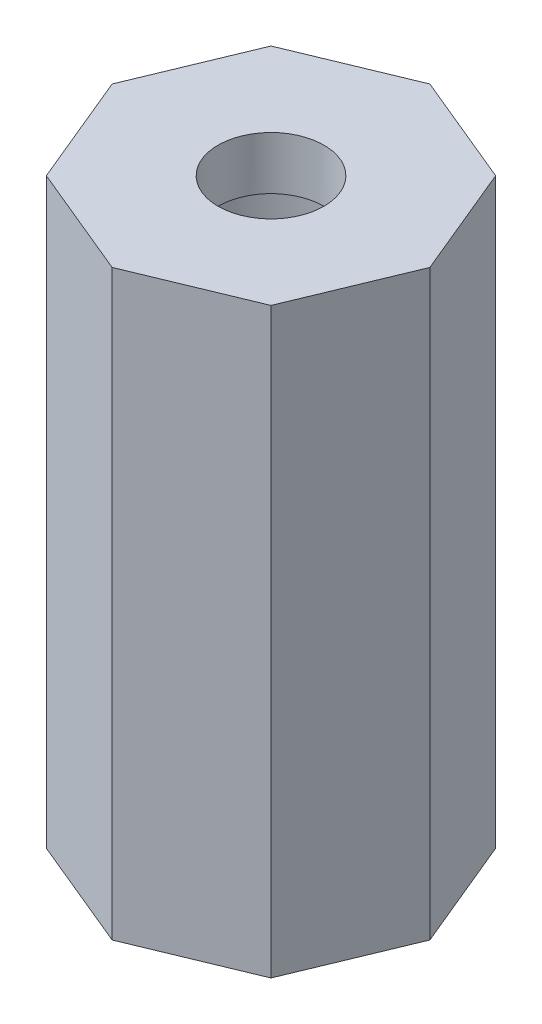
ISO-10303-21;
HEADER;
FILE_DESCRIPTION(('STEP AP214'),'2;1');
FILE_NAME('part.step','',(''),(''),'','','');
FILE_SCHEMA(('AUTOMOTIVE_DESIGN { 1 0 10303 214 1 1 1 1 }'));
ENDSEC;
DATA;
#1=APPLICATION_CONTEXT('core data for automotive mechanical design processes');
#2=APPLICATION_PROTOCOL_DEFINITION('international standard','automotive_design',2000,#1);
#3=PRODUCT_CONTEXT('',#1,'mechanical');
#4=PRODUCT('Part','Part','',(#3));
#5=PRODUCT_RELATED_PRODUCT_CATEGORY('part','',(#4));
#6=PRODUCT_DEFINITION_FORMATION('','',#4);
#7=PRODUCT_DEFINITION_CONTEXT('part definition',#1,'design');
#8=PRODUCT_DEFINITION('design','',#6,#7);
#9=PRODUCT_DEFINITION_SHAPE('','',#8);
#10=(LENGTH_UNIT() NAMED_UNIT(*) SI_UNIT(.MILLI.,.METRE.));
#11=(NAMED_UNIT(*) PLANE_ANGLE_UNIT() SI_UNIT($,.RADIAN.));
#12=(NAMED_UNIT(*) SI_UNIT($,.STERADIAN.) SOLID_ANGLE_UNIT());
#13=UNCERTAINTY_MEASURE_WITH_UNIT(LENGTH_MEASURE(1.E-05),#10,'distance_accuracy_value','');
#14=(GEOMETRIC_REPRESENTATION_CONTEXT(3) GLOBAL_UNCERTAINTY_ASSIGNED_CONTEXT((#13)) GLOBAL_UNIT_ASSIGNED_CONTEXT((#10,
#11,#12)) REPRESENTATION_CONTEXT('',''));
#15=CARTESIAN_POINT('',(0.,0.,0.));
#16=DIRECTION('',(0.,0.,1.));
#17=DIRECTION('',(1.,0.,0.));
#18=AXIS2_PLACEMENT_3D('',#15,#16,#17);
#19=CARTESIAN_POINT('',(0.,0.,0.));
#20=DIRECTION('',(0.,1.,0.));
#21=DIRECTION('',(0.,0.,1.));
#22=AXIS2_PLACEMENT_3D('',#19,#20,#21);
#23=CYLINDRICAL_SURFACE('',#22,10.);
#24=CARTESIAN_POINT('',(0.,110.,0.));
#25=DIRECTION('',(0.,1.,0.));
#26=DIRECTION('',(0.,0.,1.));
#27=AXIS2_PLACEMENT_3D('',#24,#25,#26);
#28=CIRCLE('',#27,10.);
#29=CARTESIAN_POINT('',(0.,110.,10.));
#30=VERTEX_POINT('',#29);
#31=EDGE_CURVE('E135',#30,#30,#28,.T.);
#32=ORIENTED_EDGE('',*,*,#31,.T.);
#33=EDGE_LOOP('',(#32));
#34=FACE_BOUND('',#33,.T.);
#35=CARTESIAN_POINT('',(0.,100.,0.));
#36=DIRECTION('',(0.,-1.,0.));
#37=DIRECTION('',(0.,0.,-1.));
#38=AXIS2_PLACEMENT_3D('',#35,#36,#37);
#39=CIRCLE('',#38,10.);
#40=CARTESIAN_POINT('',(0.,100.,-10.));
#41=VERTEX_POINT('',#40);
#42=EDGE_CURVE('E37',#41,#41,#39,.F.);
#43=ORIENTED_EDGE('',*,*,#42,.F.);
#44=EDGE_LOOP('',(#43));
#45=FACE_BOUND('',#44,.T.);
#46=ADVANCED_FACE('F33',(#34,#45),#23,.F.);
#47=CARTESIAN_POINT('',(21.2132034355967,110.,21.2132034355962));
#48=DIRECTION('',(-0.923879532511292,0.,-0.382683432365078));
#49=DIRECTION('',(-0.382683432365078,0.,0.923879532511292));
#50=AXIS2_PLACEMENT_3D('',#47,#48,#49);
#51=PLANE('',#50);
#52=DIRECTION('',(0.382683432365078,0.,-0.923879532511292));
#53=VECTOR('',#52,1.);
#54=CARTESIAN_POINT('',(21.2132034355967,0.,21.2132034355962));
#55=LINE('',#54,#53);
#56=CARTESIAN_POINT('',(21.2132034355967,0.,21.2132034355962));
#57=VERTEX_POINT('',#56);
#58=CARTESIAN_POINT('',(30.,0.,-3.72098185597026E-13));
#59=VERTEX_POINT('',#58);
#60=EDGE_CURVE('E131',#57,#59,#55,.T.);
#61=ORIENTED_EDGE('',*,*,#60,.T.);
#62=DIRECTION('',(0.,-1.,0.));
#63=VECTOR('',#62,1.);
#64=CARTESIAN_POINT('',(30.,110.,-3.72098185597026E-13));
#65=LINE('',#64,#63);
#66=CARTESIAN_POINT('',(30.,110.,-3.72098185597026E-13));
#67=VERTEX_POINT('',#66);
#68=EDGE_CURVE('E11',#67,#59,#65,.T.);
#69=ORIENTED_EDGE('',*,*,#68,.F.);
#70=DIRECTION('',(0.382683432365078,0.,-0.923879532511292));
#71=VECTOR('',#70,1.);
#72=CARTESIAN_POINT('',(21.2132034355967,110.,21.2132034355962));
#73=LINE('',#72,#71);
#74=CARTESIAN_POINT('',(21.2132034355967,110.,21.2132034355962));
#75=VERTEX_POINT('',#74);
#76=EDGE_CURVE('E146',#75,#67,#73,.T.);
#77=ORIENTED_EDGE('',*,*,#76,.F.);
#78=DIRECTION('',(0.,-1.,0.));
#79=VECTOR('',#78,1.);
#80=CARTESIAN_POINT('',(21.2132034355967,110.,21.2132034355962));
#81=LINE('',#80,#79);
#82=EDGE_CURVE('E127',#75,#57,#81,.T.);
#83=ORIENTED_EDGE('',*,*,#82,.T.);
#84=EDGE_LOOP('',(#61,#69,#77,#83));
#85=FACE_BOUND('',#84,.T.);
#86=ADVANCED_FACE('F35',(#85),#51,.F.);
#87=CARTESIAN_POINT('',(30.,110.,-3.72098185597026E-13));
#88=DIRECTION('',(-0.923879532511282,0.,0.382683432365101));
#89=DIRECTION('',(0.382683432365101,0.,0.923879532511282));
#90=AXIS2_PLACEMENT_3D('',#87,#88,#89);
#91=PLANE('',#90);
#92=DIRECTION('',(-0.382683432365101,0.,-0.923879532511282));
#93=VECTOR('',#92,1.);
#94=CARTESIAN_POINT('',(30.,0.,-3.72098185597026E-13));
#95=LINE('',#94,#93);
#96=CARTESIAN_POINT('',(21.2132034355962,0.,-21.2132034355967));
#97=VERTEX_POINT('',#96);
#98=EDGE_CURVE('E134',#59,#97,#95,.T.);
#99=ORIENTED_EDGE('',*,*,#98,.T.);
#100=DIRECTION('',(0.,-1.,0.));
#101=VECTOR('',#100,1.);
#102=CARTESIAN_POINT('',(21.2132034355962,110.,-21.2132034355967));
#103=LINE('',#102,#101);
#104=CARTESIAN_POINT('',(21.2132034355962,110.,-21.2132034355967));
#105=VERTEX_POINT('',#104);
#106=EDGE_CURVE('E43',#105,#97,#103,.T.);
#107=ORIENTED_EDGE('',*,*,#106,.F.);
#108=DIRECTION('',(-0.382683432365101,0.,-0.923879532511282));
#109=VECTOR('',#108,1.);
#110=CARTESIAN_POINT('',(30.,110.,-3.72098185597026E-13));
#111=LINE('',#110,#109);
#112=EDGE_CURVE('E94',#67,#105,#111,.T.);
#113=ORIENTED_EDGE('',*,*,#112,.F.);
#114=ORIENTED_EDGE('',*,*,#68,.T.);
#115=EDGE_LOOP('',(#99,#107,#113,#114));
#116=FACE_BOUND('',#115,.T.);
#117=ADVANCED_FACE('F200',(#116),#91,.F.);
#118=CARTESIAN_POINT('',(21.2132034355962,110.,-21.2132034355967));
#119=DIRECTION('',(-0.382683432365078,0.,0.923879532511292));
#120=DIRECTION('',(0.923879532511292,0.,0.382683432365078));
#121=AXIS2_PLACEMENT_3D('',#118,#119,#120);
#122=PLANE('',#121);
#123=DIRECTION('',(-0.923879532511292,0.,-0.382683432365078));
#124=VECTOR('',#123,1.);
#125=CARTESIAN_POINT('',(21.2132034355962,0.,-21.2132034355967));
#126=LINE('',#125,#124);
#127=CARTESIAN_POINT('',(-3.74350811283092E-13,0.,-30.));
#128=VERTEX_POINT('',#127);
#129=EDGE_CURVE('E137',#97,#128,#126,.T.);
#130=ORIENTED_EDGE('',*,*,#129,.T.);
#131=DIRECTION('',(0.,-1.,0.));
#132=VECTOR('',#131,1.);
#133=CARTESIAN_POINT('',(-3.74350811283092E-13,110.,-30.));
#134=LINE('',#133,#132);
#135=CARTESIAN_POINT('',(-3.74350811283092E-13,110.,-30.));
#136=VERTEX_POINT('',#135);
#137=EDGE_CURVE('E153',#136,#128,#134,.T.);
#138=ORIENTED_EDGE('',*,*,#137,.F.);
#139=DIRECTION('',(-0.923879532511292,0.,-0.382683432365078));
#140=VECTOR('',#139,1.);
#141=CARTESIAN_POINT('',(21.2132034355962,110.,-21.2132034355967));
#142=LINE('',#141,#140);
#143=EDGE_CURVE('E162',#105,#136,#142,.T.);
#144=ORIENTED_EDGE('',*,*,#143,.F.);
#145=ORIENTED_EDGE('',*,*,#106,.T.);
#146=EDGE_LOOP('',(#130,#138,#144,#145));
#147=FACE_BOUND('',#146,.T.);
#148=ADVANCED_FACE('F160',(#147),#122,.F.);
#149=CARTESIAN_POINT('',(-3.74350811283092E-13,110.,-30.));
#150=DIRECTION('',(0.382683432365101,0.,0.923879532511282));
#151=DIRECTION('',(0.923879532511282,0.,-0.382683432365101));
#152=AXIS2_PLACEMENT_3D('',#149,#150,#151);
#153=PLANE('',#152);
#154=DIRECTION('',(-0.923879532511282,0.,0.382683432365101));
#155=VECTOR('',#154,1.);
#156=CARTESIAN_POINT('',(-3.74350811283092E-13,0.,-30.));
#157=LINE('',#156,#155);
#158=CARTESIAN_POINT('',(-21.2132034355967,0.,-21.2132034355962));
#159=VERTEX_POINT('',#158);
#160=EDGE_CURVE('E139',#128,#159,#157,.T.);
#161=ORIENTED_EDGE('',*,*,#160,.T.);
#162=DIRECTION('',(0.,-1.,0.));
#163=VECTOR('',#162,1.);
#164=CARTESIAN_POINT('',(-21.2132034355967,110.,-21.2132034355962));
#165=LINE('',#164,#163);
#166=CARTESIAN_POINT('',(-21.2132034355967,110.,-21.2132034355962));
#167=VERTEX_POINT('',#166);
#168=EDGE_CURVE('E150',#167,#159,#165,.T.);
#169=ORIENTED_EDGE('',*,*,#168,.F.);
#170=DIRECTION('',(-0.923879532511282,0.,0.382683432365101));
#171=VECTOR('',#170,1.);
#172=CARTESIAN_POINT('',(-3.74350811283092E-13,110.,-30.));
#173=LINE('',#172,#171);
#174=EDGE_CURVE('E174',#136,#167,#173,.T.);
#175=ORIENTED_EDGE('',*,*,#174,.F.);
#176=ORIENTED_EDGE('',*,*,#137,.T.);
#177=EDGE_LOOP('',(#161,#169,#175,#176));
#178=FACE_BOUND('',#177,.T.);
#179=ADVANCED_FACE('F170',(#178),#153,.F.);
#180=CARTESIAN_POINT('',(-21.2132034355967,110.,-21.2132034355962));
#181=DIRECTION('',(0.923879532511292,0.,0.382683432365078));
#182=DIRECTION('',(0.382683432365078,0.,-0.923879532511292));
#183=AXIS2_PLACEMENT_3D('',#180,#181,#182);
#184=PLANE('',#183);
#185=DIRECTION('',(-0.382683432365078,0.,0.923879532511291));
#186=VECTOR('',#185,1.);
#187=CARTESIAN_POINT('',(-21.2132034355967,0.,-21.2132034355962));
#188=LINE('',#187,#186);
#189=CARTESIAN_POINT('',(-30.,0.,3.62158969811015E-13));
#190=VERTEX_POINT('',#189);
#191=EDGE_CURVE('E141',#159,#190,#188,.T.);
#192=ORIENTED_EDGE('',*,*,#191,.T.);
#193=DIRECTION('',(0.,-1.,0.));
#194=VECTOR('',#193,1.);
#195=CARTESIAN_POINT('',(-30.,110.,3.62158969811015E-13));
#196=LINE('',#195,#194);
#197=CARTESIAN_POINT('',(-30.,110.,3.62158969811015E-13));
#198=VERTEX_POINT('',#197);
#199=EDGE_CURVE('E122',#198,#190,#196,.T.);
#200=ORIENTED_EDGE('',*,*,#199,.F.);
#201=DIRECTION('',(-0.382683432365078,0.,0.923879532511291));
#202=VECTOR('',#201,1.);
#203=CARTESIAN_POINT('',(-21.2132034355967,110.,-21.2132034355962));
#204=LINE('',#203,#202);
#205=EDGE_CURVE('E113',#167,#198,#204,.T.);
#206=ORIENTED_EDGE('',*,*,#205,.F.);
#207=ORIENTED_EDGE('',*,*,#168,.T.);
#208=EDGE_LOOP('',(#192,#200,#206,#207));
#209=FACE_BOUND('',#208,.T.);
#210=ADVANCED_FACE('F173',(#209),#184,.F.);
#211=CARTESIAN_POINT('',(-30.,110.,3.62158969811015E-13));
#212=DIRECTION('',(0.923879532511282,0.,-0.382683432365101));
#213=DIRECTION('',(-0.382683432365101,0.,-0.923879532511282));
#214=AXIS2_PLACEMENT_3D('',#211,#212,#213);
#215=PLANE('',#214);
#216=DIRECTION('',(0.382683432365101,0.,0.923879532511282));
#217=VECTOR('',#216,1.);
#218=CARTESIAN_POINT('',(-30.,0.,3.62158969811015E-13));
#219=LINE('',#218,#217);
#220=CARTESIAN_POINT('',(-21.2132034355962,0.,21.2132034355967));
#221=VERTEX_POINT('',#220);
#222=EDGE_CURVE('E121',#190,#221,#219,.T.);
#223=ORIENTED_EDGE('',*,*,#222,.T.);
#224=DIRECTION('',(0.,-1.,0.));
#225=VECTOR('',#224,1.);
#226=CARTESIAN_POINT('',(-21.2132034355962,110.,21.2132034355967));
#227=LINE('',#226,#225);
#228=CARTESIAN_POINT('',(-21.2132034355962,110.,21.2132034355967));
#229=VERTEX_POINT('',#228);
#230=EDGE_CURVE('E118',#229,#221,#227,.T.);
#231=ORIENTED_EDGE('',*,*,#230,.F.);
#232=DIRECTION('',(0.382683432365101,0.,0.923879532511282));
#233=VECTOR('',#232,1.);
#234=CARTESIAN_POINT('',(-30.,110.,3.62158969811015E-13));
#235=LINE('',#234,#233);
#236=EDGE_CURVE('E107',#198,#229,#235,.T.);
#237=ORIENTED_EDGE('',*,*,#236,.F.);
#238=ORIENTED_EDGE('',*,*,#199,.T.);
#239=EDGE_LOOP('',(#223,#231,#237,#238));
#240=FACE_BOUND('',#239,.T.);
#241=ADVANCED_FACE('F119',(#240),#215,.F.);
#242=CARTESIAN_POINT('',(-21.2132034355962,110.,21.2132034355967));
#243=DIRECTION('',(0.382683432365079,0.,-0.923879532511291));
#244=DIRECTION('',(-0.923879532511291,0.,-0.382683432365079));
#245=AXIS2_PLACEMENT_3D('',#242,#243,#244);
#246=PLANE('',#245);
#247=DIRECTION('',(0.923879532511292,0.,0.382683432365079));
#248=VECTOR('',#247,1.);
#249=CARTESIAN_POINT('',(-21.2132034355962,0.,21.2132034355967));
#250=LINE('',#249,#248);
#251=CARTESIAN_POINT('',(3.72293910964724E-13,0.,30.));
#252=VERTEX_POINT('',#251);
#253=EDGE_CURVE('E80',#221,#252,#250,.T.);
#254=ORIENTED_EDGE('',*,*,#253,.T.);
#255=DIRECTION('',(0.,-1.,0.));
#256=VECTOR('',#255,1.);
#257=CARTESIAN_POINT('',(3.72293910964724E-13,110.,30.));
#258=LINE('',#257,#256);
#259=CARTESIAN_POINT('',(3.72293910964724E-13,110.,30.));
#260=VERTEX_POINT('',#259);
#261=EDGE_CURVE('E123',#260,#252,#258,.T.);
#262=ORIENTED_EDGE('',*,*,#261,.F.);
#263=DIRECTION('',(0.923879532511292,0.,0.382683432365079));
#264=VECTOR('',#263,1.);
#265=CARTESIAN_POINT('',(-21.2132034355962,110.,21.2132034355967));
#266=LINE('',#265,#264);
#267=EDGE_CURVE('E111',#229,#260,#266,.T.);
#268=ORIENTED_EDGE('',*,*,#267,.F.);
#269=ORIENTED_EDGE('',*,*,#230,.T.);
#270=EDGE_LOOP('',(#254,#262,#268,#269));
#271=FACE_BOUND('',#270,.T.);
#272=ADVANCED_FACE('F125',(#271),#246,.F.);
#273=CARTESIAN_POINT('',(3.72293910964724E-13,110.,30.));
#274=DIRECTION('',(-0.382683432365101,0.,-0.923879532511282));
#275=DIRECTION('',(-0.923879532511282,0.,0.382683432365101));
#276=AXIS2_PLACEMENT_3D('',#273,#274,#275);
#277=PLANE('',#276);
#278=DIRECTION('',(0.923879532511282,0.,-0.382683432365101));
#279=VECTOR('',#278,1.);
#280=CARTESIAN_POINT('',(3.72293910964724E-13,0.,30.));
#281=LINE('',#280,#279);
#282=EDGE_CURVE('E86',#252,#57,#281,.T.);
#283=ORIENTED_EDGE('',*,*,#282,.T.);
#284=ORIENTED_EDGE('',*,*,#82,.F.);
#285=DIRECTION('',(0.923879532511282,0.,-0.382683432365101));
#286=VECTOR('',#285,1.);
#287=CARTESIAN_POINT('',(3.72293910964724E-13,110.,30.));
#288=LINE('',#287,#286);
#289=EDGE_CURVE('E51',#260,#75,#288,.T.);
#290=ORIENTED_EDGE('',*,*,#289,.F.);
#291=ORIENTED_EDGE('',*,*,#261,.T.);
#292=EDGE_LOOP('',(#283,#284,#290,#291));
#293=FACE_BOUND('',#292,.T.);
#294=ADVANCED_FACE('F208',(#293),#277,.F.);
#295=CARTESIAN_POINT('',(0.,110.,0.));
#296=DIRECTION('',(0.,1.,0.));
#297=DIRECTION('',(0.,0.,1.));
#298=AXIS2_PLACEMENT_3D('',#295,#296,#297);
#299=PLANE('',#298);
#300=ORIENTED_EDGE('',*,*,#31,.F.);
#301=EDGE_LOOP('',(#300));
#302=FACE_BOUND('',#301,.T.);
#303=ORIENTED_EDGE('',*,*,#76,.T.);
#304=ORIENTED_EDGE('',*,*,#112,.T.);
#305=ORIENTED_EDGE('',*,*,#143,.T.);
#306=ORIENTED_EDGE('',*,*,#174,.T.);
#307=ORIENTED_EDGE('',*,*,#205,.T.);
#308=ORIENTED_EDGE('',*,*,#236,.T.);
#309=ORIENTED_EDGE('',*,*,#267,.T.);
#310=ORIENTED_EDGE('',*,*,#289,.T.);
#311=EDGE_LOOP('',(#303,#304,#305,#306,#307,#308,#309,#310));
#312=FACE_BOUND('',#311,.T.);
#313=ADVANCED_FACE('F109',(#302,#312),#299,.T.);
#314=CARTESIAN_POINT('',(0.,0.,0.));
#315=DIRECTION('',(0.,1.,0.));
#316=DIRECTION('',(0.,0.,1.));
#317=AXIS2_PLACEMENT_3D('',#314,#315,#316);
#318=PLANE('',#317);
#319=CARTESIAN_POINT('',(0.,0.,0.));
#320=DIRECTION('',(0.,-1.,0.));
#321=DIRECTION('',(0.,0.,-1.));
#322=AXIS2_PLACEMENT_3D('',#319,#320,#321);
#323=CIRCLE('',#322,20.);
#324=CARTESIAN_POINT('',(0.,0.,-20.));
#325=VERTEX_POINT('',#324);
#326=EDGE_CURVE('E182',#325,#325,#323,.T.);
#327=ORIENTED_EDGE('',*,*,#326,.F.);
#328=EDGE_LOOP('',(#327));
#329=FACE_BOUND('',#328,.T.);
#330=ORIENTED_EDGE('',*,*,#60,.F.);
#331=ORIENTED_EDGE('',*,*,#282,.F.);
#332=ORIENTED_EDGE('',*,*,#253,.F.);
#333=ORIENTED_EDGE('',*,*,#222,.F.);
#334=ORIENTED_EDGE('',*,*,#191,.F.);
#335=ORIENTED_EDGE('',*,*,#160,.F.);
#336=ORIENTED_EDGE('',*,*,#129,.F.);
#337=ORIENTED_EDGE('',*,*,#98,.F.);
#338=EDGE_LOOP('',(#330,#331,#332,#333,#334,#335,#336,#337));
#339=FACE_BOUND('',#338,.T.);
#340=ADVANCED_FACE('F166',(#329,#339),#318,.F.);
#341=CARTESIAN_POINT('',(0.,100.,0.));
#342=DIRECTION('',(0.,-1.,0.));
#343=DIRECTION('',(0.,0.,-1.));
#344=AXIS2_PLACEMENT_3D('',#341,#342,#343);
#345=PLANE('',#344);
#346=CARTESIAN_POINT('',(0.,100.,0.));
#347=DIRECTION('',(0.,-1.,0.));
#348=DIRECTION('',(0.,0.,-1.));
#349=AXIS2_PLACEMENT_3D('',#346,#347,#348);
#350=CIRCLE('',#349,20.);
#351=CARTESIAN_POINT('',(0.,100.,-20.));
#352=VERTEX_POINT('',#351);
#353=EDGE_CURVE('E185',#352,#352,#350,.T.);
#354=ORIENTED_EDGE('',*,*,#353,.T.);
#355=EDGE_LOOP('',(#354));
#356=FACE_BOUND('',#355,.T.);
#357=ORIENTED_EDGE('',*,*,#42,.T.);
#358=EDGE_LOOP('',(#357));
#359=FACE_BOUND('',#358,.T.);
#360=ADVANCED_FACE('F192',(#356,#359),#345,.T.);
#361=CARTESIAN_POINT('',(0.,100.,0.));
#362=DIRECTION('',(0.,-1.,0.));
#363=DIRECTION('',(0.,0.,-1.));
#364=AXIS2_PLACEMENT_3D('',#361,#362,#363);
#365=CYLINDRICAL_SURFACE('',#364,20.);
#366=ORIENTED_EDGE('',*,*,#353,.F.);
#367=EDGE_LOOP('',(#366));
#368=FACE_BOUND('',#367,.T.);
#369=ORIENTED_EDGE('',*,*,#326,.T.);
#370=EDGE_LOOP('',(#369));
#371=FACE_BOUND('',#370,.T.);
#372=ADVANCED_FACE('F204',(#368,#371),#365,.F.);
#373=CLOSED_SHELL('',(#46,#86,#117,#148,#179,#210,#241,#272,#294,#313,#340,#360,#372));
#374=MANIFOLD_SOLID_BREP('B2',#373);
#375=ADVANCED_BREP_SHAPE_REPRESENTATION('',(#18,#374),#14);
#376=SHAPE_DEFINITION_REPRESENTATION(#9,#375);
ENDSEC;
END-ISO-10303-21;
